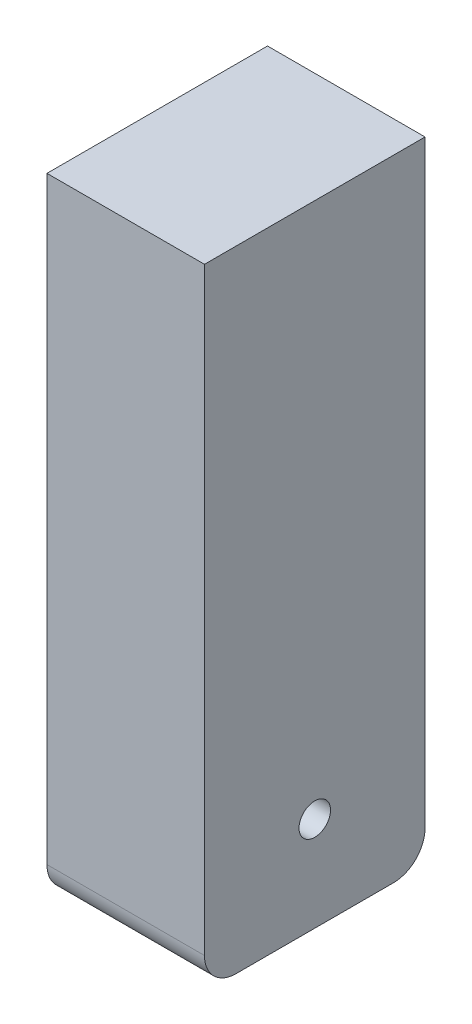
ISO-10303-21;
HEADER;
FILE_DESCRIPTION(('STEP AP214'),'2;1');
FILE_NAME('part.step','',(''),(''),'','','');
FILE_SCHEMA(('AUTOMOTIVE_DESIGN { 1 0 10303 214 1 1 1 1 }'));
ENDSEC;
DATA;
#1=APPLICATION_CONTEXT('core data for automotive mechanical design processes');
#2=APPLICATION_PROTOCOL_DEFINITION('international standard','automotive_design',2000,#1);
#3=PRODUCT_CONTEXT('',#1,'mechanical');
#4=PRODUCT('Part','Part','',(#3));
#5=PRODUCT_RELATED_PRODUCT_CATEGORY('part','',(#4));
#6=PRODUCT_DEFINITION_FORMATION('','',#4);
#7=PRODUCT_DEFINITION_CONTEXT('part definition',#1,'design');
#8=PRODUCT_DEFINITION('design','',#6,#7);
#9=PRODUCT_DEFINITION_SHAPE('','',#8);
#10=(LENGTH_UNIT() NAMED_UNIT(*) SI_UNIT(.MILLI.,.METRE.));
#11=(NAMED_UNIT(*) PLANE_ANGLE_UNIT() SI_UNIT($,.RADIAN.));
#12=(NAMED_UNIT(*) SI_UNIT($,.STERADIAN.) SOLID_ANGLE_UNIT());
#13=UNCERTAINTY_MEASURE_WITH_UNIT(LENGTH_MEASURE(1.E-05),#10,'distance_accuracy_value','');
#14=(GEOMETRIC_REPRESENTATION_CONTEXT(3) GLOBAL_UNCERTAINTY_ASSIGNED_CONTEXT((#13)) GLOBAL_UNIT_ASSIGNED_CONTEXT((#10,
#11,#12)) REPRESENTATION_CONTEXT('',''));
#15=CARTESIAN_POINT('',(0.,0.,0.));
#16=DIRECTION('',(0.,0.,1.));
#17=DIRECTION('',(1.,0.,0.));
#18=AXIS2_PLACEMENT_3D('',#15,#16,#17);
#19=CARTESIAN_POINT('',(25.,200.,-35.));
#20=DIRECTION('',(-1.,0.,0.));
#21=DIRECTION('',(0.,0.,1.));
#22=AXIS2_PLACEMENT_3D('',#19,#20,#21);
#23=PLANE('',#22);
#24=CARTESIAN_POINT('',(25.,30.,0.));
#25=DIRECTION('',(-1.,0.,0.));
#26=DIRECTION('',(0.,0.,1.));
#27=AXIS2_PLACEMENT_3D('',#24,#25,#26);
#28=CIRCLE('',#27,5.);
#29=CARTESIAN_POINT('',(25.,30.,5.));
#30=VERTEX_POINT('',#29);
#31=EDGE_CURVE('E149',#30,#30,#28,.T.);
#32=ORIENTED_EDGE('',*,*,#31,.T.);
#33=EDGE_LOOP('',(#32));
#34=FACE_BOUND('',#33,.T.);
#35=DIRECTION('',(0.,0.,-1.));
#36=VECTOR('',#35,1.);
#37=CARTESIAN_POINT('',(25.,0.,-35.));
#38=LINE('',#37,#36);
#39=CARTESIAN_POINT('',(25.,0.,25.));
#40=VERTEX_POINT('',#39);
#41=CARTESIAN_POINT('',(25.,0.,-25.));
#42=VERTEX_POINT('',#41);
#43=EDGE_CURVE('E144',#40,#42,#38,.T.);
#44=ORIENTED_EDGE('',*,*,#43,.T.);
#45=CARTESIAN_POINT('',(25.,10.,-25.));
#46=DIRECTION('',(-1.,0.,0.));
#47=DIRECTION('',(0.,0.,1.));
#48=AXIS2_PLACEMENT_3D('',#45,#46,#47);
#49=CIRCLE('',#48,10.);
#50=CARTESIAN_POINT('',(25.,10.,-35.));
#51=VERTEX_POINT('',#50);
#52=EDGE_CURVE('E48',#42,#51,#49,.F.);
#53=ORIENTED_EDGE('',*,*,#52,.T.);
#54=DIRECTION('',(0.,-1.,0.));
#55=VECTOR('',#54,1.);
#56=CARTESIAN_POINT('',(25.,200.,-35.));
#57=LINE('',#56,#55);
#58=CARTESIAN_POINT('',(25.,200.,-35.));
#59=VERTEX_POINT('',#58);
#60=EDGE_CURVE('E100',#59,#51,#57,.T.);
#61=ORIENTED_EDGE('',*,*,#60,.F.);
#62=DIRECTION('',(0.,0.,-1.));
#63=VECTOR('',#62,1.);
#64=CARTESIAN_POINT('',(25.,200.,-35.));
#65=LINE('',#64,#63);
#66=CARTESIAN_POINT('',(25.,200.,35.));
#67=VERTEX_POINT('',#66);
#68=EDGE_CURVE('E108',#67,#59,#65,.T.);
#69=ORIENTED_EDGE('',*,*,#68,.F.);
#70=DIRECTION('',(0.,-1.,0.));
#71=VECTOR('',#70,1.);
#72=CARTESIAN_POINT('',(25.,200.,35.));
#73=LINE('',#72,#71);
#74=CARTESIAN_POINT('',(25.,10.,35.));
#75=VERTEX_POINT('',#74);
#76=EDGE_CURVE('E145',#67,#75,#73,.T.);
#77=ORIENTED_EDGE('',*,*,#76,.T.);
#78=CARTESIAN_POINT('',(25.,10.,25.));
#79=DIRECTION('',(-1.,0.,0.));
#80=DIRECTION('',(0.,0.,1.));
#81=AXIS2_PLACEMENT_3D('',#78,#79,#80);
#82=CIRCLE('',#81,10.);
#83=EDGE_CURVE('E55',#75,#40,#82,.F.);
#84=ORIENTED_EDGE('',*,*,#83,.T.);
#85=EDGE_LOOP('',(#44,#53,#61,#69,#77,#84));
#86=FACE_BOUND('',#85,.T.);
#87=ADVANCED_FACE('F39',(#34,#86),#23,.F.);
#88=CARTESIAN_POINT('',(-25.,200.,-35.));
#89=DIRECTION('',(0.,0.,1.));
#90=DIRECTION('',(1.,0.,0.));
#91=AXIS2_PLACEMENT_3D('',#88,#89,#90);
#92=PLANE('',#91);
#93=ORIENTED_EDGE('',*,*,#60,.T.);
#94=DIRECTION('',(-1.,0.,0.));
#95=VECTOR('',#94,1.);
#96=CARTESIAN_POINT('',(-25.,10.,-35.));
#97=LINE('',#96,#95);
#98=CARTESIAN_POINT('',(-25.,10.,-35.));
#99=VERTEX_POINT('',#98);
#100=EDGE_CURVE('E122',#51,#99,#97,.T.);
#101=ORIENTED_EDGE('',*,*,#100,.T.);
#102=DIRECTION('',(0.,-1.,0.));
#103=VECTOR('',#102,1.);
#104=CARTESIAN_POINT('',(-25.,200.,-35.));
#105=LINE('',#104,#103);
#106=CARTESIAN_POINT('',(-25.,200.,-35.));
#107=VERTEX_POINT('',#106);
#108=EDGE_CURVE('E103',#107,#99,#105,.T.);
#109=ORIENTED_EDGE('',*,*,#108,.F.);
#110=DIRECTION('',(-1.,0.,0.));
#111=VECTOR('',#110,1.);
#112=CARTESIAN_POINT('',(-25.,200.,-35.));
#113=LINE('',#112,#111);
#114=EDGE_CURVE('E95',#59,#107,#113,.T.);
#115=ORIENTED_EDGE('',*,*,#114,.F.);
#116=EDGE_LOOP('',(#93,#101,#109,#115));
#117=FACE_BOUND('',#116,.T.);
#118=ADVANCED_FACE('F97',(#117),#92,.F.);
#119=CARTESIAN_POINT('',(-25.,200.,-35.));
#120=DIRECTION('',(1.,0.,0.));
#121=DIRECTION('',(0.,0.,-1.));
#122=AXIS2_PLACEMENT_3D('',#119,#120,#121);
#123=PLANE('',#122);
#124=CARTESIAN_POINT('',(-25.,30.,0.));
#125=DIRECTION('',(-1.,0.,0.));
#126=DIRECTION('',(0.,0.,1.));
#127=AXIS2_PLACEMENT_3D('',#124,#125,#126);
#128=CIRCLE('',#127,5.);
#129=CARTESIAN_POINT('',(-25.,30.,5.));
#130=VERTEX_POINT('',#129);
#131=EDGE_CURVE('E171',#130,#130,#128,.T.);
#132=ORIENTED_EDGE('',*,*,#131,.F.);
#133=EDGE_LOOP('',(#132));
#134=FACE_BOUND('',#133,.T.);
#135=ORIENTED_EDGE('',*,*,#108,.T.);
#136=CARTESIAN_POINT('',(-25.,10.,-25.));
#137=DIRECTION('',(1.,0.,0.));
#138=DIRECTION('',(0.,0.,-1.));
#139=AXIS2_PLACEMENT_3D('',#136,#137,#138);
#140=CIRCLE('',#139,10.);
#141=CARTESIAN_POINT('',(-25.,0.,-25.));
#142=VERTEX_POINT('',#141);
#143=EDGE_CURVE('E134',#99,#142,#140,.F.);
#144=ORIENTED_EDGE('',*,*,#143,.T.);
#145=DIRECTION('',(0.,0.,1.));
#146=VECTOR('',#145,1.);
#147=CARTESIAN_POINT('',(-25.,0.,-35.));
#148=LINE('',#147,#146);
#149=CARTESIAN_POINT('',(-25.,0.,25.));
#150=VERTEX_POINT('',#149);
#151=EDGE_CURVE('E118',#142,#150,#148,.T.);
#152=ORIENTED_EDGE('',*,*,#151,.T.);
#153=CARTESIAN_POINT('',(-25.,10.,25.));
#154=DIRECTION('',(1.,0.,0.));
#155=DIRECTION('',(0.,0.,-1.));
#156=AXIS2_PLACEMENT_3D('',#153,#154,#155);
#157=CIRCLE('',#156,10.);
#158=CARTESIAN_POINT('',(-25.,10.,35.));
#159=VERTEX_POINT('',#158);
#160=EDGE_CURVE('E126',#150,#159,#157,.F.);
#161=ORIENTED_EDGE('',*,*,#160,.T.);
#162=DIRECTION('',(0.,-1.,0.));
#163=VECTOR('',#162,1.);
#164=CARTESIAN_POINT('',(-25.,200.,35.));
#165=LINE('',#164,#163);
#166=CARTESIAN_POINT('',(-25.,200.,35.));
#167=VERTEX_POINT('',#166);
#168=EDGE_CURVE('E128',#167,#159,#165,.T.);
#169=ORIENTED_EDGE('',*,*,#168,.F.);
#170=DIRECTION('',(0.,0.,1.));
#171=VECTOR('',#170,1.);
#172=CARTESIAN_POINT('',(-25.,200.,-35.));
#173=LINE('',#172,#171);
#174=EDGE_CURVE('E107',#107,#167,#173,.T.);
#175=ORIENTED_EDGE('',*,*,#174,.F.);
#176=EDGE_LOOP('',(#135,#144,#152,#161,#169,#175));
#177=FACE_BOUND('',#176,.T.);
#178=ADVANCED_FACE('F155',(#134,#177),#123,.F.);
#179=CARTESIAN_POINT('',(-25.,200.,35.));
#180=DIRECTION('',(0.,0.,-1.));
#181=DIRECTION('',(-1.,0.,0.));
#182=AXIS2_PLACEMENT_3D('',#179,#180,#181);
#183=PLANE('',#182);
#184=ORIENTED_EDGE('',*,*,#168,.T.);
#185=DIRECTION('',(1.,0.,0.));
#186=VECTOR('',#185,1.);
#187=CARTESIAN_POINT('',(-25.,10.,35.));
#188=LINE('',#187,#186);
#189=EDGE_CURVE('E11',#159,#75,#188,.T.);
#190=ORIENTED_EDGE('',*,*,#189,.T.);
#191=ORIENTED_EDGE('',*,*,#76,.F.);
#192=DIRECTION('',(1.,0.,0.));
#193=VECTOR('',#192,1.);
#194=CARTESIAN_POINT('',(-25.,200.,35.));
#195=LINE('',#194,#193);
#196=EDGE_CURVE('E113',#167,#67,#195,.T.);
#197=ORIENTED_EDGE('',*,*,#196,.F.);
#198=EDGE_LOOP('',(#184,#190,#191,#197));
#199=FACE_BOUND('',#198,.T.);
#200=ADVANCED_FACE('F157',(#199),#183,.F.);
#201=CARTESIAN_POINT('',(0.,200.,0.));
#202=DIRECTION('',(0.,1.,0.));
#203=DIRECTION('',(0.,0.,1.));
#204=AXIS2_PLACEMENT_3D('',#201,#202,#203);
#205=PLANE('',#204);
#206=ORIENTED_EDGE('',*,*,#68,.T.);
#207=ORIENTED_EDGE('',*,*,#114,.T.);
#208=ORIENTED_EDGE('',*,*,#174,.T.);
#209=ORIENTED_EDGE('',*,*,#196,.T.);
#210=EDGE_LOOP('',(#206,#207,#208,#209));
#211=FACE_BOUND('',#210,.T.);
#212=ADVANCED_FACE('F111',(#211),#205,.T.);
#213=CARTESIAN_POINT('',(0.,0.,0.));
#214=DIRECTION('',(0.,1.,0.));
#215=DIRECTION('',(0.,0.,1.));
#216=AXIS2_PLACEMENT_3D('',#213,#214,#215);
#217=PLANE('',#216);
#218=ORIENTED_EDGE('',*,*,#151,.F.);
#219=DIRECTION('',(-1.,0.,0.));
#220=VECTOR('',#219,1.);
#221=CARTESIAN_POINT('',(0.,0.,-25.));
#222=LINE('',#221,#220);
#223=EDGE_CURVE('E62',#142,#42,#222,.F.);
#224=ORIENTED_EDGE('',*,*,#223,.T.);
#225=ORIENTED_EDGE('',*,*,#43,.F.);
#226=DIRECTION('',(1.,0.,0.));
#227=VECTOR('',#226,1.);
#228=CARTESIAN_POINT('',(0.,0.,25.));
#229=LINE('',#228,#227);
#230=EDGE_CURVE('E137',#40,#150,#229,.F.);
#231=ORIENTED_EDGE('',*,*,#230,.T.);
#232=EDGE_LOOP('',(#218,#224,#225,#231));
#233=FACE_BOUND('',#232,.T.);
#234=ADVANCED_FACE('F146',(#233),#217,.F.);
#235=CARTESIAN_POINT('',(175.,30.,0.));
#236=DIRECTION('',(-1.,0.,0.));
#237=DIRECTION('',(0.,0.,1.));
#238=AXIS2_PLACEMENT_3D('',#235,#236,#237);
#239=CYLINDRICAL_SURFACE('',#238,5.);
#240=ORIENTED_EDGE('',*,*,#131,.T.);
#241=EDGE_LOOP('',(#240));
#242=FACE_BOUND('',#241,.T.);
#243=ORIENTED_EDGE('',*,*,#31,.F.);
#244=EDGE_LOOP('',(#243));
#245=FACE_BOUND('',#244,.T.);
#246=ADVANCED_FACE('F176',(#242,#245),#239,.F.);
#247=CARTESIAN_POINT('',(-25.,10.,-25.));
#248=DIRECTION('',(-1.,0.,0.));
#249=DIRECTION('',(0.,0.,1.));
#250=AXIS2_PLACEMENT_3D('',#247,#248,#249);
#251=CYLINDRICAL_SURFACE('',#250,10.);
#252=ORIENTED_EDGE('',*,*,#52,.F.);
#253=ORIENTED_EDGE('',*,*,#223,.F.);
#254=ORIENTED_EDGE('',*,*,#143,.F.);
#255=ORIENTED_EDGE('',*,*,#100,.F.);
#256=EDGE_LOOP('',(#252,#253,#254,#255));
#257=FACE_BOUND('',#256,.T.);
#258=ADVANCED_FACE('F192',(#257),#251,.T.);
#259=CARTESIAN_POINT('',(-25.,10.,25.));
#260=DIRECTION('',(1.,0.,0.));
#261=DIRECTION('',(0.,0.,-1.));
#262=AXIS2_PLACEMENT_3D('',#259,#260,#261);
#263=CYLINDRICAL_SURFACE('',#262,10.);
#264=ORIENTED_EDGE('',*,*,#160,.F.);
#265=ORIENTED_EDGE('',*,*,#230,.F.);
#266=ORIENTED_EDGE('',*,*,#83,.F.);
#267=ORIENTED_EDGE('',*,*,#189,.F.);
#268=EDGE_LOOP('',(#264,#265,#266,#267));
#269=FACE_BOUND('',#268,.T.);
#270=ADVANCED_FACE('F41',(#269),#263,.T.);
#271=CLOSED_SHELL('',(#87,#118,#178,#200,#212,#234,#246,#258,#270));
#272=MANIFOLD_SOLID_BREP('B2',#271);
#273=ADVANCED_BREP_SHAPE_REPRESENTATION('',(#18,#272),#14);
#274=SHAPE_DEFINITION_REPRESENTATION(#9,#273);
ENDSEC;
END-ISO-10303-21;
